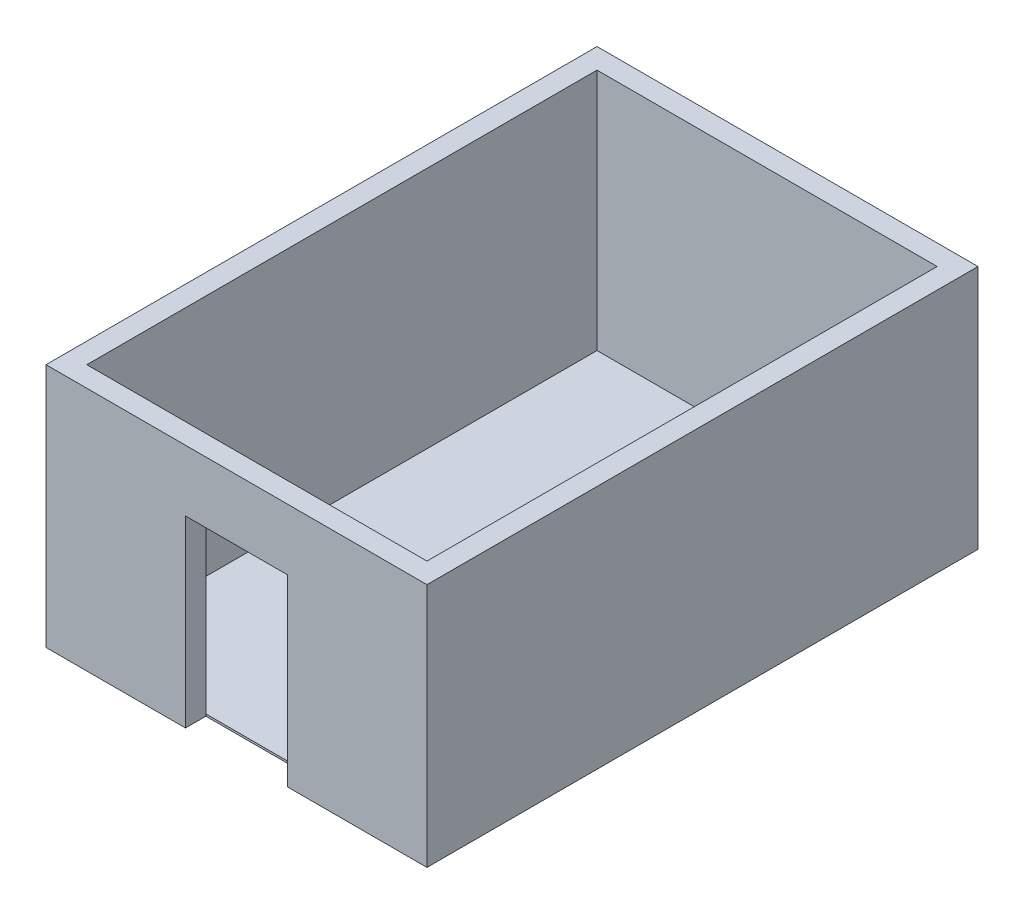
ISO-10303-21;
HEADER;
FILE_DESCRIPTION(('STEP AP214'),'2;1');
FILE_NAME('part.step','',(''),(''),'','','');
FILE_SCHEMA(('AUTOMOTIVE_DESIGN { 1 0 10303 214 1 1 1 1 }'));
ENDSEC;
DATA;
#1=APPLICATION_CONTEXT('core data for automotive mechanical design processes');
#2=APPLICATION_PROTOCOL_DEFINITION('international standard','automotive_design',2000,#1);
#3=PRODUCT_CONTEXT('',#1,'mechanical');
#4=PRODUCT('Part','Part','',(#3));
#5=PRODUCT_RELATED_PRODUCT_CATEGORY('part','',(#4));
#6=PRODUCT_DEFINITION_FORMATION('','',#4);
#7=PRODUCT_DEFINITION_CONTEXT('part definition',#1,'design');
#8=PRODUCT_DEFINITION('design','',#6,#7);
#9=PRODUCT_DEFINITION_SHAPE('','',#8);
#10=(LENGTH_UNIT() NAMED_UNIT(*) SI_UNIT(.MILLI.,.METRE.));
#11=(NAMED_UNIT(*) PLANE_ANGLE_UNIT() SI_UNIT($,.RADIAN.));
#12=(NAMED_UNIT(*) SI_UNIT($,.STERADIAN.) SOLID_ANGLE_UNIT());
#13=UNCERTAINTY_MEASURE_WITH_UNIT(LENGTH_MEASURE(1.E-05),#10,'distance_accuracy_value','');
#14=(GEOMETRIC_REPRESENTATION_CONTEXT(3) GLOBAL_UNCERTAINTY_ASSIGNED_CONTEXT((#13)) GLOBAL_UNIT_ASSIGNED_CONTEXT((#10,
#11,#12)) REPRESENTATION_CONTEXT('',''));
#15=CARTESIAN_POINT('',(0.,0.,0.));
#16=DIRECTION('',(0.,0.,1.));
#17=DIRECTION('',(1.,0.,0.));
#18=AXIS2_PLACEMENT_3D('',#15,#16,#17);
#19=CARTESIAN_POINT('',(0.,304.8,0.));
#20=DIRECTION('',(0.,1.,0.));
#21=DIRECTION('',(0.,0.,1.));
#22=AXIS2_PLACEMENT_3D('',#19,#20,#21);
#23=PLANE('',#22);
#24=DIRECTION('',(0.,0.,1.));
#25=VECTOR('',#24,1.);
#26=CARTESIAN_POINT('',(-237.066666666667,304.8,317.5));
#27=LINE('',#26,#25);
#28=CARTESIAN_POINT('',(-237.066666666667,304.8,-342.9));
#29=VERTEX_POINT('',#28);
#30=CARTESIAN_POINT('',(-237.066666666667,304.8,342.9));
#31=VERTEX_POINT('',#30);
#32=EDGE_CURVE('E216',#29,#31,#27,.T.);
#33=ORIENTED_EDGE('',*,*,#32,.T.);
#34=DIRECTION('',(1.,0.,0.));
#35=VECTOR('',#34,1.);
#36=CARTESIAN_POINT('',(211.666666666667,304.8,342.9));
#37=LINE('',#36,#35);
#38=CARTESIAN_POINT('',(237.066666666667,304.8,342.9));
#39=VERTEX_POINT('',#38);
#40=EDGE_CURVE('E219',#31,#39,#37,.T.);
#41=ORIENTED_EDGE('',*,*,#40,.T.);
#42=DIRECTION('',(0.,0.,-1.));
#43=VECTOR('',#42,1.);
#44=CARTESIAN_POINT('',(237.066666666667,304.8,317.5));
#45=LINE('',#44,#43);
#46=CARTESIAN_POINT('',(237.066666666667,304.8,-342.9));
#47=VERTEX_POINT('',#46);
#48=EDGE_CURVE('E222',#39,#47,#45,.T.);
#49=ORIENTED_EDGE('',*,*,#48,.T.);
#50=DIRECTION('',(-1.,0.,0.));
#51=VECTOR('',#50,1.);
#52=CARTESIAN_POINT('',(211.666666666667,304.8,-342.9));
#53=LINE('',#52,#51);
#54=EDGE_CURVE('E224',#47,#29,#53,.T.);
#55=ORIENTED_EDGE('',*,*,#54,.T.);
#56=EDGE_LOOP('',(#33,#41,#49,#55));
#57=FACE_BOUND('',#56,.T.);
#58=DIRECTION('',(1.,0.,0.));
#59=VECTOR('',#58,1.);
#60=CARTESIAN_POINT('',(211.666666666667,304.8,317.5));
#61=LINE('',#60,#59);
#62=CARTESIAN_POINT('',(-211.666666666667,304.8,317.5));
#63=VERTEX_POINT('',#62);
#64=CARTESIAN_POINT('',(211.666666666667,304.8,317.5));
#65=VERTEX_POINT('',#64);
#66=EDGE_CURVE('E197',#63,#65,#61,.T.);
#67=ORIENTED_EDGE('',*,*,#66,.F.);
#68=DIRECTION('',(0.,0.,1.));
#69=VECTOR('',#68,1.);
#70=CARTESIAN_POINT('',(-211.666666666667,304.8,317.5));
#71=LINE('',#70,#69);
#72=CARTESIAN_POINT('',(-211.666666666667,304.8,-317.5));
#73=VERTEX_POINT('',#72);
#74=EDGE_CURVE('E195',#73,#63,#71,.T.);
#75=ORIENTED_EDGE('',*,*,#74,.F.);
#76=DIRECTION('',(-1.,0.,0.));
#77=VECTOR('',#76,1.);
#78=CARTESIAN_POINT('',(211.666666666667,304.8,-317.5));
#79=LINE('',#78,#77);
#80=CARTESIAN_POINT('',(211.666666666667,304.8,-317.5));
#81=VERTEX_POINT('',#80);
#82=EDGE_CURVE('E202',#81,#73,#79,.T.);
#83=ORIENTED_EDGE('',*,*,#82,.F.);
#84=DIRECTION('',(0.,0.,-1.));
#85=VECTOR('',#84,1.);
#86=CARTESIAN_POINT('',(211.666666666667,304.8,317.5));
#87=LINE('',#86,#85);
#88=EDGE_CURVE('E199',#65,#81,#87,.T.);
#89=ORIENTED_EDGE('',*,*,#88,.F.);
#90=EDGE_LOOP('',(#67,#75,#83,#89));
#91=FACE_BOUND('',#90,.T.);
#92=ADVANCED_FACE('F58',(#57,#91),#23,.T.);
#93=CARTESIAN_POINT('',(0.,0.,0.));
#94=DIRECTION('',(0.,1.,0.));
#95=DIRECTION('',(0.,0.,1.));
#96=AXIS2_PLACEMENT_3D('',#93,#94,#95);
#97=PLANE('',#96);
#98=DIRECTION('',(1.,0.,0.));
#99=VECTOR('',#98,1.);
#100=CARTESIAN_POINT('',(63.5000000000001,0.,317.5));
#101=LINE('',#100,#99);
#102=CARTESIAN_POINT('',(-63.5,0.,317.5));
#103=VERTEX_POINT('',#102);
#104=CARTESIAN_POINT('',(63.5000000000001,0.,317.5));
#105=VERTEX_POINT('',#104);
#106=EDGE_CURVE('E158',#103,#105,#101,.T.);
#107=ORIENTED_EDGE('',*,*,#106,.F.);
#108=DIRECTION('',(0.,0.,1.));
#109=VECTOR('',#108,1.);
#110=CARTESIAN_POINT('',(-63.5,0.,317.5));
#111=LINE('',#110,#109);
#112=CARTESIAN_POINT('',(-63.5,0.,342.9));
#113=VERTEX_POINT('',#112);
#114=EDGE_CURVE('E184',#103,#113,#111,.T.);
#115=ORIENTED_EDGE('',*,*,#114,.T.);
#116=DIRECTION('',(1.,0.,0.));
#117=VECTOR('',#116,1.);
#118=CARTESIAN_POINT('',(211.666666666667,0.,342.9));
#119=LINE('',#118,#117);
#120=CARTESIAN_POINT('',(-237.066666666667,0.,342.9));
#121=VERTEX_POINT('',#120);
#122=EDGE_CURVE('E229',#121,#113,#119,.T.);
#123=ORIENTED_EDGE('',*,*,#122,.F.);
#124=DIRECTION('',(0.,0.,1.));
#125=VECTOR('',#124,1.);
#126=CARTESIAN_POINT('',(-237.066666666667,0.,317.5));
#127=LINE('',#126,#125);
#128=CARTESIAN_POINT('',(-237.066666666667,0.,-342.9));
#129=VERTEX_POINT('',#128);
#130=EDGE_CURVE('E215',#129,#121,#127,.T.);
#131=ORIENTED_EDGE('',*,*,#130,.F.);
#132=DIRECTION('',(-1.,0.,0.));
#133=VECTOR('',#132,1.);
#134=CARTESIAN_POINT('',(211.666666666667,0.,-342.9));
#135=LINE('',#134,#133);
#136=CARTESIAN_POINT('',(237.066666666667,0.,-342.9));
#137=VERTEX_POINT('',#136);
#138=EDGE_CURVE('E220',#137,#129,#135,.T.);
#139=ORIENTED_EDGE('',*,*,#138,.F.);
#140=DIRECTION('',(0.,0.,-1.));
#141=VECTOR('',#140,1.);
#142=CARTESIAN_POINT('',(237.066666666667,0.,317.5));
#143=LINE('',#142,#141);
#144=CARTESIAN_POINT('',(237.066666666667,0.,342.9));
#145=VERTEX_POINT('',#144);
#146=EDGE_CURVE('E232',#145,#137,#143,.T.);
#147=ORIENTED_EDGE('',*,*,#146,.F.);
#148=CARTESIAN_POINT('',(63.5,0.,342.9));
#149=VERTEX_POINT('',#148);
#150=EDGE_CURVE('E170',#149,#145,#119,.T.);
#151=ORIENTED_EDGE('',*,*,#150,.F.);
#152=DIRECTION('',(0.,0.,1.));
#153=VECTOR('',#152,1.);
#154=CARTESIAN_POINT('',(63.5000000000001,0.,317.5));
#155=LINE('',#154,#153);
#156=EDGE_CURVE('E73',#105,#149,#155,.T.);
#157=ORIENTED_EDGE('',*,*,#156,.F.);
#158=EDGE_LOOP('',(#107,#115,#123,#131,#139,#147,#151,#157));
#159=FACE_BOUND('',#158,.T.);
#160=ADVANCED_FACE('F168',(#159),#97,.F.);
#161=CARTESIAN_POINT('',(-237.066666666667,304.8,317.5));
#162=DIRECTION('',(1.,0.,0.));
#163=DIRECTION('',(0.,0.,-1.));
#164=AXIS2_PLACEMENT_3D('',#161,#162,#163);
#165=PLANE('',#164);
#166=ORIENTED_EDGE('',*,*,#130,.T.);
#167=DIRECTION('',(0.,-1.,0.));
#168=VECTOR('',#167,1.);
#169=CARTESIAN_POINT('',(-237.066666666667,304.8,342.9));
#170=LINE('',#169,#168);
#171=EDGE_CURVE('E12',#31,#121,#170,.T.);
#172=ORIENTED_EDGE('',*,*,#171,.F.);
#173=ORIENTED_EDGE('',*,*,#32,.F.);
#174=DIRECTION('',(0.,-1.,0.));
#175=VECTOR('',#174,1.);
#176=CARTESIAN_POINT('',(-237.066666666667,304.8,-342.9));
#177=LINE('',#176,#175);
#178=EDGE_CURVE('E226',#29,#129,#177,.T.);
#179=ORIENTED_EDGE('',*,*,#178,.T.);
#180=EDGE_LOOP('',(#166,#172,#173,#179));
#181=FACE_BOUND('',#180,.T.);
#182=ADVANCED_FACE('F60',(#181),#165,.F.);
#183=CARTESIAN_POINT('',(211.666666666667,304.8,342.9));
#184=DIRECTION('',(0.,0.,-1.));
#185=DIRECTION('',(-1.,0.,0.));
#186=AXIS2_PLACEMENT_3D('',#183,#184,#185);
#187=PLANE('',#186);
#188=ORIENTED_EDGE('',*,*,#122,.T.);
#189=DIRECTION('',(0.,-1.,0.));
#190=VECTOR('',#189,1.);
#191=CARTESIAN_POINT('',(-63.5,0.,342.9));
#192=LINE('',#191,#190);
#193=CARTESIAN_POINT('',(-63.5,228.6,342.9));
#194=VERTEX_POINT('',#193);
#195=EDGE_CURVE('E165',#194,#113,#192,.T.);
#196=ORIENTED_EDGE('',*,*,#195,.F.);
#197=DIRECTION('',(-1.,0.,0.));
#198=VECTOR('',#197,1.);
#199=CARTESIAN_POINT('',(-63.5,228.6,342.9));
#200=LINE('',#199,#198);
#201=CARTESIAN_POINT('',(63.5,228.6,342.9));
#202=VERTEX_POINT('',#201);
#203=EDGE_CURVE('E264',#202,#194,#200,.T.);
#204=ORIENTED_EDGE('',*,*,#203,.F.);
#205=DIRECTION('',(0.,1.,0.));
#206=VECTOR('',#205,1.);
#207=CARTESIAN_POINT('',(63.5,228.6,342.9));
#208=LINE('',#207,#206);
#209=EDGE_CURVE('E267',#149,#202,#208,.T.);
#210=ORIENTED_EDGE('',*,*,#209,.F.);
#211=ORIENTED_EDGE('',*,*,#150,.T.);
#212=DIRECTION('',(0.,-1.,0.));
#213=VECTOR('',#212,1.);
#214=CARTESIAN_POINT('',(237.066666666667,304.8,342.9));
#215=LINE('',#214,#213);
#216=EDGE_CURVE('E66',#39,#145,#215,.T.);
#217=ORIENTED_EDGE('',*,*,#216,.F.);
#218=ORIENTED_EDGE('',*,*,#40,.F.);
#219=ORIENTED_EDGE('',*,*,#171,.T.);
#220=EDGE_LOOP('',(#188,#196,#204,#210,#211,#217,#218,#219));
#221=FACE_BOUND('',#220,.T.);
#222=ADVANCED_FACE('F257',(#221),#187,.F.);
#223=CARTESIAN_POINT('',(237.066666666667,304.8,317.5));
#224=DIRECTION('',(-1.,0.,0.));
#225=DIRECTION('',(0.,0.,1.));
#226=AXIS2_PLACEMENT_3D('',#223,#224,#225);
#227=PLANE('',#226);
#228=ORIENTED_EDGE('',*,*,#146,.T.);
#229=DIRECTION('',(0.,-1.,0.));
#230=VECTOR('',#229,1.);
#231=CARTESIAN_POINT('',(237.066666666667,304.8,-342.9));
#232=LINE('',#231,#230);
#233=EDGE_CURVE('E237',#47,#137,#232,.T.);
#234=ORIENTED_EDGE('',*,*,#233,.F.);
#235=ORIENTED_EDGE('',*,*,#48,.F.);
#236=ORIENTED_EDGE('',*,*,#216,.T.);
#237=EDGE_LOOP('',(#228,#234,#235,#236));
#238=FACE_BOUND('',#237,.T.);
#239=ADVANCED_FACE('F243',(#238),#227,.F.);
#240=CARTESIAN_POINT('',(211.666666666667,304.8,-342.9));
#241=DIRECTION('',(0.,0.,1.));
#242=DIRECTION('',(1.,0.,0.));
#243=AXIS2_PLACEMENT_3D('',#240,#241,#242);
#244=PLANE('',#243);
#245=ORIENTED_EDGE('',*,*,#138,.T.);
#246=ORIENTED_EDGE('',*,*,#178,.F.);
#247=ORIENTED_EDGE('',*,*,#54,.F.);
#248=ORIENTED_EDGE('',*,*,#233,.T.);
#249=EDGE_LOOP('',(#245,#246,#247,#248));
#250=FACE_BOUND('',#249,.T.);
#251=ADVANCED_FACE('F250',(#250),#244,.F.);
#252=CARTESIAN_POINT('',(-211.666666666667,304.8,317.5));
#253=DIRECTION('',(1.,0.,0.));
#254=DIRECTION('',(0.,0.,-1.));
#255=AXIS2_PLACEMENT_3D('',#252,#253,#254);
#256=PLANE('',#255);
#257=DIRECTION('',(0.,0.,1.));
#258=VECTOR('',#257,1.);
#259=CARTESIAN_POINT('',(-211.666666666667,2.54,317.5));
#260=LINE('',#259,#258);
#261=CARTESIAN_POINT('',(-211.666666666667,2.54,-317.5));
#262=VERTEX_POINT('',#261);
#263=CARTESIAN_POINT('',(-211.666666666667,2.5400000000001,317.5));
#264=VERTEX_POINT('',#263);
#265=EDGE_CURVE('E180',#262,#264,#260,.T.);
#266=ORIENTED_EDGE('',*,*,#265,.F.);
#267=DIRECTION('',(0.,-1.,0.));
#268=VECTOR('',#267,1.);
#269=CARTESIAN_POINT('',(-211.666666666667,304.8,-317.5));
#270=LINE('',#269,#268);
#271=EDGE_CURVE('E204',#73,#262,#270,.T.);
#272=ORIENTED_EDGE('',*,*,#271,.F.);
#273=ORIENTED_EDGE('',*,*,#74,.T.);
#274=DIRECTION('',(0.,-1.,0.));
#275=VECTOR('',#274,1.);
#276=CARTESIAN_POINT('',(-211.666666666667,304.8,317.5));
#277=LINE('',#276,#275);
#278=EDGE_CURVE('E212',#63,#264,#277,.T.);
#279=ORIENTED_EDGE('',*,*,#278,.T.);
#280=EDGE_LOOP('',(#266,#272,#273,#279));
#281=FACE_BOUND('',#280,.T.);
#282=ADVANCED_FACE('F296',(#281),#256,.T.);
#283=CARTESIAN_POINT('',(211.666666666667,304.8,317.5));
#284=DIRECTION('',(0.,0.,-1.));
#285=DIRECTION('',(-1.,0.,0.));
#286=AXIS2_PLACEMENT_3D('',#283,#284,#285);
#287=PLANE('',#286);
#288=DIRECTION('',(0.,-1.,0.));
#289=VECTOR('',#288,1.);
#290=CARTESIAN_POINT('',(-63.5,0.,317.5));
#291=LINE('',#290,#289);
#292=CARTESIAN_POINT('',(-63.5,228.6,317.5));
#293=VERTEX_POINT('',#292);
#294=CARTESIAN_POINT('',(-63.5,2.54,317.5));
#295=VERTEX_POINT('',#294);
#296=EDGE_CURVE('E172',#293,#295,#291,.T.);
#297=ORIENTED_EDGE('',*,*,#296,.T.);
#298=DIRECTION('',(1.,0.,0.));
#299=VECTOR('',#298,1.);
#300=CARTESIAN_POINT('',(211.666666666667,2.54,317.5));
#301=LINE('',#300,#299);
#302=EDGE_CURVE('E185',#264,#295,#301,.T.);
#303=ORIENTED_EDGE('',*,*,#302,.F.);
#304=ORIENTED_EDGE('',*,*,#278,.F.);
#305=ORIENTED_EDGE('',*,*,#66,.T.);
#306=DIRECTION('',(0.,-1.,0.));
#307=VECTOR('',#306,1.);
#308=CARTESIAN_POINT('',(211.666666666667,304.8,317.5));
#309=LINE('',#308,#307);
#310=CARTESIAN_POINT('',(211.666666666667,2.5400000000001,317.5));
#311=VERTEX_POINT('',#310);
#312=EDGE_CURVE('E209',#65,#311,#309,.T.);
#313=ORIENTED_EDGE('',*,*,#312,.T.);
#314=CARTESIAN_POINT('',(63.5000000000001,2.54,317.5));
#315=VERTEX_POINT('',#314);
#316=EDGE_CURVE('E183',#315,#311,#301,.T.);
#317=ORIENTED_EDGE('',*,*,#316,.F.);
#318=DIRECTION('',(0.,1.,0.));
#319=VECTOR('',#318,1.);
#320=CARTESIAN_POINT('',(63.5,228.6,317.5));
#321=LINE('',#320,#319);
#322=CARTESIAN_POINT('',(63.5,228.6,317.5));
#323=VERTEX_POINT('',#322);
#324=EDGE_CURVE('E153',#315,#323,#321,.T.);
#325=ORIENTED_EDGE('',*,*,#324,.T.);
#326=DIRECTION('',(-1.,0.,0.));
#327=VECTOR('',#326,1.);
#328=CARTESIAN_POINT('',(-63.5,228.6,317.5));
#329=LINE('',#328,#327);
#330=EDGE_CURVE('E155',#323,#293,#329,.T.);
#331=ORIENTED_EDGE('',*,*,#330,.T.);
#332=EDGE_LOOP('',(#297,#303,#304,#305,#313,#317,#325,#331));
#333=FACE_BOUND('',#332,.T.);
#334=ADVANCED_FACE('F272',(#333),#287,.T.);
#335=CARTESIAN_POINT('',(211.666666666667,304.8,317.5));
#336=DIRECTION('',(-1.,0.,0.));
#337=DIRECTION('',(0.,0.,1.));
#338=AXIS2_PLACEMENT_3D('',#335,#336,#337);
#339=PLANE('',#338);
#340=DIRECTION('',(0.,0.,-1.));
#341=VECTOR('',#340,1.);
#342=CARTESIAN_POINT('',(211.666666666667,2.54,317.5));
#343=LINE('',#342,#341);
#344=CARTESIAN_POINT('',(211.666666666667,2.5400000000001,-317.5));
#345=VERTEX_POINT('',#344);
#346=EDGE_CURVE('E188',#311,#345,#343,.T.);
#347=ORIENTED_EDGE('',*,*,#346,.F.);
#348=ORIENTED_EDGE('',*,*,#312,.F.);
#349=ORIENTED_EDGE('',*,*,#88,.T.);
#350=DIRECTION('',(0.,-1.,0.));
#351=VECTOR('',#350,1.);
#352=CARTESIAN_POINT('',(211.666666666667,304.8,-317.5));
#353=LINE('',#352,#351);
#354=EDGE_CURVE('E206',#81,#345,#353,.T.);
#355=ORIENTED_EDGE('',*,*,#354,.T.);
#356=EDGE_LOOP('',(#347,#348,#349,#355));
#357=FACE_BOUND('',#356,.T.);
#358=ADVANCED_FACE('F324',(#357),#339,.T.);
#359=CARTESIAN_POINT('',(211.666666666667,304.8,-317.5));
#360=DIRECTION('',(0.,0.,1.));
#361=DIRECTION('',(1.,0.,0.));
#362=AXIS2_PLACEMENT_3D('',#359,#360,#361);
#363=PLANE('',#362);
#364=DIRECTION('',(-1.,0.,0.));
#365=VECTOR('',#364,1.);
#366=CARTESIAN_POINT('',(211.666666666667,2.54,-317.5));
#367=LINE('',#366,#365);
#368=EDGE_CURVE('E192',#345,#262,#367,.T.);
#369=ORIENTED_EDGE('',*,*,#368,.F.);
#370=ORIENTED_EDGE('',*,*,#354,.F.);
#371=ORIENTED_EDGE('',*,*,#82,.T.);
#372=ORIENTED_EDGE('',*,*,#271,.T.);
#373=EDGE_LOOP('',(#369,#370,#371,#372));
#374=FACE_BOUND('',#373,.T.);
#375=ADVANCED_FACE('F285',(#374),#363,.T.);
#376=CARTESIAN_POINT('',(0.,2.54,0.));
#377=DIRECTION('',(0.,1.,0.));
#378=DIRECTION('',(0.,0.,1.));
#379=AXIS2_PLACEMENT_3D('',#376,#377,#378);
#380=PLANE('',#379);
#381=ORIENTED_EDGE('',*,*,#265,.T.);
#382=ORIENTED_EDGE('',*,*,#302,.T.);
#383=EDGE_CURVE('E189',#295,#315,#301,.T.);
#384=ORIENTED_EDGE('',*,*,#383,.T.);
#385=ORIENTED_EDGE('',*,*,#316,.T.);
#386=ORIENTED_EDGE('',*,*,#346,.T.);
#387=ORIENTED_EDGE('',*,*,#368,.T.);
#388=EDGE_LOOP('',(#381,#382,#384,#385,#386,#387));
#389=FACE_BOUND('',#388,.T.);
#390=ADVANCED_FACE('F278',(#389),#380,.T.);
#391=CARTESIAN_POINT('',(-63.5,0.,317.5));
#392=DIRECTION('',(-1.,0.,0.));
#393=DIRECTION('',(0.,-1.,0.));
#394=AXIS2_PLACEMENT_3D('',#391,#392,#393);
#395=PLANE('',#394);
#396=ORIENTED_EDGE('',*,*,#195,.T.);
#397=ORIENTED_EDGE('',*,*,#114,.F.);
#398=EDGE_CURVE('E161',#295,#103,#291,.T.);
#399=ORIENTED_EDGE('',*,*,#398,.F.);
#400=ORIENTED_EDGE('',*,*,#296,.F.);
#401=DIRECTION('',(0.,0.,1.));
#402=VECTOR('',#401,1.);
#403=CARTESIAN_POINT('',(-63.5,228.6,317.5));
#404=LINE('',#403,#402);
#405=EDGE_CURVE('E174',#293,#194,#404,.T.);
#406=ORIENTED_EDGE('',*,*,#405,.T.);
#407=EDGE_LOOP('',(#396,#397,#399,#400,#406));
#408=FACE_BOUND('',#407,.T.);
#409=ADVANCED_FACE('F276',(#408),#395,.F.);
#410=CARTESIAN_POINT('',(-63.5,228.6,317.5));
#411=DIRECTION('',(0.,1.,0.));
#412=DIRECTION('',(0.,0.,1.));
#413=AXIS2_PLACEMENT_3D('',#410,#411,#412);
#414=PLANE('',#413);
#415=ORIENTED_EDGE('',*,*,#203,.T.);
#416=ORIENTED_EDGE('',*,*,#405,.F.);
#417=ORIENTED_EDGE('',*,*,#330,.F.);
#418=DIRECTION('',(0.,0.,1.));
#419=VECTOR('',#418,1.);
#420=CARTESIAN_POINT('',(63.5,228.6,317.5));
#421=LINE('',#420,#419);
#422=EDGE_CURVE('E171',#323,#202,#421,.T.);
#423=ORIENTED_EDGE('',*,*,#422,.T.);
#424=EDGE_LOOP('',(#415,#416,#417,#423));
#425=FACE_BOUND('',#424,.T.);
#426=ADVANCED_FACE('F275',(#425),#414,.F.);
#427=CARTESIAN_POINT('',(63.5,228.6,317.5));
#428=DIRECTION('',(1.,0.,0.));
#429=DIRECTION('',(0.,1.,0.));
#430=AXIS2_PLACEMENT_3D('',#427,#428,#429);
#431=PLANE('',#430);
#432=ORIENTED_EDGE('',*,*,#209,.T.);
#433=ORIENTED_EDGE('',*,*,#422,.F.);
#434=ORIENTED_EDGE('',*,*,#324,.F.);
#435=EDGE_CURVE('E80',#105,#315,#321,.T.);
#436=ORIENTED_EDGE('',*,*,#435,.F.);
#437=ORIENTED_EDGE('',*,*,#156,.T.);
#438=EDGE_LOOP('',(#432,#433,#434,#436,#437));
#439=FACE_BOUND('',#438,.T.);
#440=ADVANCED_FACE('F151',(#439),#431,.F.);
#441=CARTESIAN_POINT('',(0.,0.,317.5));
#442=DIRECTION('',(0.,0.,-1.));
#443=DIRECTION('',(-1.,0.,0.));
#444=AXIS2_PLACEMENT_3D('',#441,#442,#443);
#445=PLANE('',#444);
#446=ORIENTED_EDGE('',*,*,#383,.F.);
#447=ORIENTED_EDGE('',*,*,#398,.T.);
#448=ORIENTED_EDGE('',*,*,#106,.T.);
#449=ORIENTED_EDGE('',*,*,#435,.T.);
#450=EDGE_LOOP('',(#446,#447,#448,#449));
#451=FACE_BOUND('',#450,.T.);
#452=ADVANCED_FACE('F159',(#451),#445,.F.);
#453=CLOSED_SHELL('',(#92,#160,#182,#222,#239,#251,#282,#334,#358,#375,#390,#409,#426,#440,#452));
#454=MANIFOLD_SOLID_BREP('B2',#453);
#455=ADVANCED_BREP_SHAPE_REPRESENTATION('',(#18,#454),#14);
#456=SHAPE_DEFINITION_REPRESENTATION(#9,#455);
ENDSEC;
END-ISO-10303-21;
